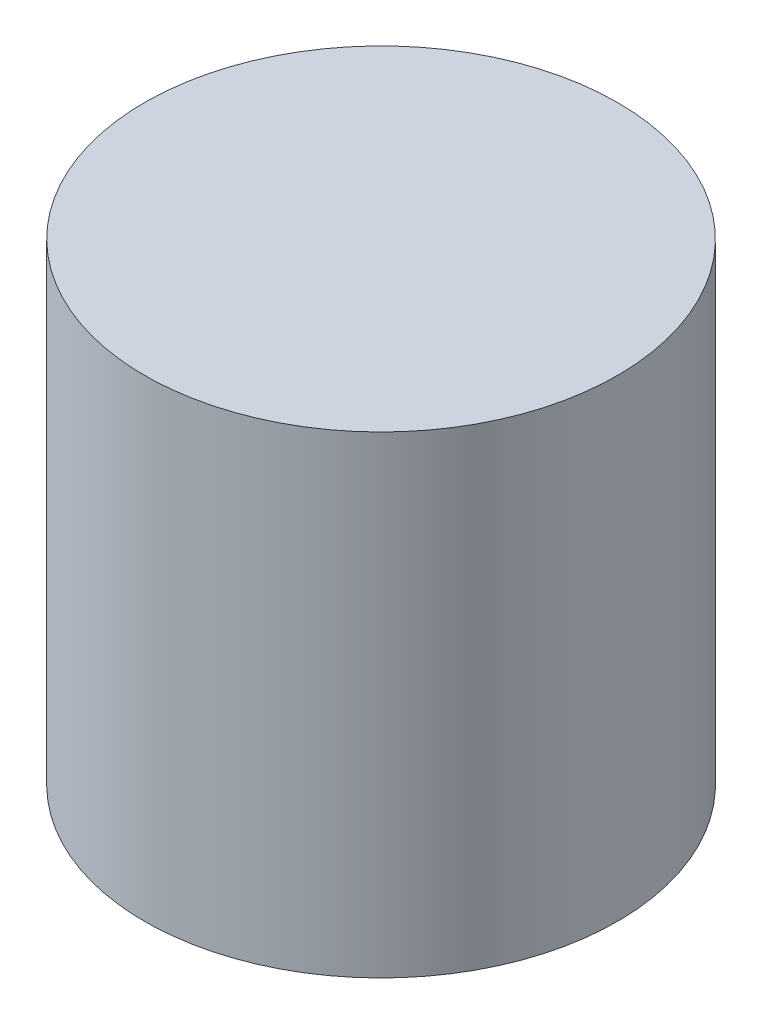
ISO-10303-21;
HEADER;
FILE_DESCRIPTION(('STEP AP214'),'2;1');
FILE_NAME('part.step','',(''),(''),'','','');
FILE_SCHEMA(('AUTOMOTIVE_DESIGN { 1 0 10303 214 1 1 1 1 }'));
ENDSEC;
DATA;
#1=APPLICATION_CONTEXT('core data for automotive mechanical design processes');
#2=APPLICATION_PROTOCOL_DEFINITION('international standard','automotive_design',2000,#1);
#3=PRODUCT_CONTEXT('',#1,'mechanical');
#4=PRODUCT('Part','Part','',(#3));
#5=PRODUCT_RELATED_PRODUCT_CATEGORY('part','',(#4));
#6=PRODUCT_DEFINITION_FORMATION('','',#4);
#7=PRODUCT_DEFINITION_CONTEXT('part definition',#1,'design');
#8=PRODUCT_DEFINITION('design','',#6,#7);
#9=PRODUCT_DEFINITION_SHAPE('','',#8);
#10=(LENGTH_UNIT() NAMED_UNIT(*) SI_UNIT(.MILLI.,.METRE.));
#11=(NAMED_UNIT(*) PLANE_ANGLE_UNIT() SI_UNIT($,.RADIAN.));
#12=(NAMED_UNIT(*) SI_UNIT($,.STERADIAN.) SOLID_ANGLE_UNIT());
#13=UNCERTAINTY_MEASURE_WITH_UNIT(LENGTH_MEASURE(1.E-05),#10,'distance_accuracy_value','');
#14=(GEOMETRIC_REPRESENTATION_CONTEXT(3) GLOBAL_UNCERTAINTY_ASSIGNED_CONTEXT((#13)) GLOBAL_UNIT_ASSIGNED_CONTEXT((#10,
#11,#12)) REPRESENTATION_CONTEXT('',''));
#15=CARTESIAN_POINT('',(0.,0.,0.));
#16=DIRECTION('',(0.,0.,1.));
#17=DIRECTION('',(1.,0.,0.));
#18=AXIS2_PLACEMENT_3D('',#15,#16,#17);
#19=CARTESIAN_POINT('',(0.,0.,0.));
#20=DIRECTION('',(0.,-1.,0.));
#21=DIRECTION('',(0.,0.,-1.));
#22=AXIS2_PLACEMENT_3D('',#19,#20,#21);
#23=CYLINDRICAL_SURFACE('',#22,35.);
#24=CARTESIAN_POINT('',(0.,65.,0.));
#25=DIRECTION('',(0.,1.,0.));
#26=DIRECTION('',(0.,0.,1.));
#27=AXIS2_PLACEMENT_3D('',#24,#25,#26);
#28=CIRCLE('',#27,35.);
#29=CARTESIAN_POINT('',(-32.6917420765551,65.,12.5));
#30=VERTEX_POINT('',#29);
#31=CARTESIAN_POINT('',(-32.6917420765551,65.,-12.5));
#32=VERTEX_POINT('',#31);
#33=EDGE_CURVE('E170',#30,#32,#28,.F.);
#34=ORIENTED_EDGE('',*,*,#33,.F.);
#35=DIRECTION('',(0.,-1.,0.));
#36=VECTOR('',#35,1.);
#37=CARTESIAN_POINT('',(-32.6917420765551,65.,12.5));
#38=LINE('',#37,#36);
#39=CARTESIAN_POINT('',(-32.6917420765551,5.,12.5));
#40=VERTEX_POINT('',#39);
#41=EDGE_CURVE('E130',#30,#40,#38,.T.);
#42=ORIENTED_EDGE('',*,*,#41,.T.);
#43=CARTESIAN_POINT('',(0.,5.,0.));
#44=DIRECTION('',(0.,1.,0.));
#45=DIRECTION('',(0.,0.,1.));
#46=AXIS2_PLACEMENT_3D('',#43,#44,#45);
#47=CIRCLE('',#46,35.);
#48=CARTESIAN_POINT('',(-32.691742076555,5.00000000000001,-12.5));
#49=VERTEX_POINT('',#48);
#50=EDGE_CURVE('E168',#40,#49,#47,.F.);
#51=ORIENTED_EDGE('',*,*,#50,.T.);
#52=DIRECTION('',(0.,-1.,0.));
#53=VECTOR('',#52,1.);
#54=CARTESIAN_POINT('',(-32.6917420765551,65.,-12.5));
#55=LINE('',#54,#53);
#56=EDGE_CURVE('E73',#32,#49,#55,.T.);
#57=ORIENTED_EDGE('',*,*,#56,.F.);
#58=EDGE_LOOP('',(#34,#42,#51,#57));
#59=FACE_BOUND('',#58,.T.);
#60=CARTESIAN_POINT('',(0.,70.,0.));
#61=DIRECTION('',(0.,-1.,0.));
#62=DIRECTION('',(0.,0.,-1.));
#63=AXIS2_PLACEMENT_3D('',#60,#61,#62);
#64=CIRCLE('',#63,35.);
#65=CARTESIAN_POINT('',(0.,70.,-35.));
#66=VERTEX_POINT('',#65);
#67=EDGE_CURVE('E129',#66,#66,#64,.T.);
#68=ORIENTED_EDGE('',*,*,#67,.T.);
#69=EDGE_LOOP('',(#68));
#70=FACE_BOUND('',#69,.T.);
#71=CARTESIAN_POINT('',(0.,0.,0.));
#72=DIRECTION('',(0.,-1.,0.));
#73=DIRECTION('',(0.,0.,-1.));
#74=AXIS2_PLACEMENT_3D('',#71,#72,#73);
#75=CIRCLE('',#74,35.);
#76=CARTESIAN_POINT('',(0.,0.,-35.));
#77=VERTEX_POINT('',#76);
#78=EDGE_CURVE('E123',#77,#77,#75,.T.);
#79=ORIENTED_EDGE('',*,*,#78,.F.);
#80=EDGE_LOOP('',(#79));
#81=FACE_BOUND('',#80,.T.);
#82=CARTESIAN_POINT('',(0.,54.9863118256936,0.));
#83=DIRECTION('',(0.,1.,0.));
#84=DIRECTION('',(-1.,0.,0.));
#85=AXIS2_PLACEMENT_3D('',#82,#83,#84);
#86=CIRCLE('',#85,35.);
#87=CARTESIAN_POINT('',(-18.6665575968191,54.9863118256936,-29.6067496947002));
#88=VERTEX_POINT('',#87);
#89=CARTESIAN_POINT('',(17.3852178868639,54.9863118256935,-30.3768694737669));
#90=VERTEX_POINT('',#89);
#91=EDGE_CURVE('E58',#88,#90,#86,.F.);
#92=ORIENTED_EDGE('',*,*,#91,.F.);
#93=DIRECTION('',(0.,-1.,0.));
#94=VECTOR('',#93,1.);
#95=CARTESIAN_POINT('',(-18.6665575968191,54.9863118256936,-29.6067496947002));
#96=LINE('',#95,#94);
#97=CARTESIAN_POINT('',(-18.6665575968192,14.9863118256936,-29.6067496947002));
#98=VERTEX_POINT('',#97);
#99=EDGE_CURVE('E104',#88,#98,#96,.T.);
#100=ORIENTED_EDGE('',*,*,#99,.T.);
#101=CARTESIAN_POINT('',(0.,14.9863118256936,0.));
#102=DIRECTION('',(0.,1.,0.));
#103=DIRECTION('',(-1.,0.,0.));
#104=AXIS2_PLACEMENT_3D('',#101,#102,#103);
#105=CIRCLE('',#104,35.);
#106=CARTESIAN_POINT('',(17.3852178868639,14.9863118256935,-30.3768694737669));
#107=VERTEX_POINT('',#106);
#108=EDGE_CURVE('E13',#98,#107,#105,.F.);
#109=ORIENTED_EDGE('',*,*,#108,.T.);
#110=DIRECTION('',(0.,-1.,0.));
#111=VECTOR('',#110,1.);
#112=CARTESIAN_POINT('',(17.3852178868639,54.9863118256935,-30.3768694737668));
#113=LINE('',#112,#111);
#114=EDGE_CURVE('E92',#90,#107,#113,.T.);
#115=ORIENTED_EDGE('',*,*,#114,.F.);
#116=EDGE_LOOP('',(#92,#100,#109,#115));
#117=FACE_BOUND('',#116,.T.);
#118=ADVANCED_FACE('F48',(#59,#70,#81,#117),#23,.T.);
#119=CARTESIAN_POINT('',(0.,70.,0.));
#120=DIRECTION('',(0.,1.,0.));
#121=DIRECTION('',(0.,0.,1.));
#122=AXIS2_PLACEMENT_3D('',#119,#120,#121);
#123=PLANE('',#122);
#124=ORIENTED_EDGE('',*,*,#67,.F.);
#125=EDGE_LOOP('',(#124));
#126=FACE_BOUND('',#125,.T.);
#127=ADVANCED_FACE('F50',(#126),#123,.T.);
#128=CARTESIAN_POINT('',(0.,0.,0.));
#129=DIRECTION('',(0.,-1.,0.));
#130=DIRECTION('',(0.,0.,-1.));
#131=AXIS2_PLACEMENT_3D('',#128,#129,#130);
#132=PLANE('',#131);
#133=ORIENTED_EDGE('',*,*,#78,.T.);
#134=EDGE_LOOP('',(#133));
#135=FACE_BOUND('',#134,.T.);
#136=ADVANCED_FACE('F196',(#135),#132,.T.);
#137=CARTESIAN_POINT('',(-32.691742076555,0.,0.));
#138=DIRECTION('',(1.,0.,0.));
#139=DIRECTION('',(0.,0.,-1.));
#140=AXIS2_PLACEMENT_3D('',#137,#138,#139);
#141=PLANE('',#140);
#142=DIRECTION('',(0.,0.,-1.));
#143=VECTOR('',#142,1.);
#144=CARTESIAN_POINT('',(-32.6917420765551,65.,12.5));
#145=LINE('',#144,#143);
#146=EDGE_CURVE('E146',#30,#32,#145,.T.);
#147=ORIENTED_EDGE('',*,*,#146,.T.);
#148=ORIENTED_EDGE('',*,*,#56,.T.);
#149=DIRECTION('',(0.,0.,-1.));
#150=VECTOR('',#149,1.);
#151=CARTESIAN_POINT('',(-32.6917420765551,5.,12.5));
#152=LINE('',#151,#150);
#153=EDGE_CURVE('E143',#40,#49,#152,.T.);
#154=ORIENTED_EDGE('',*,*,#153,.F.);
#155=ORIENTED_EDGE('',*,*,#41,.F.);
#156=EDGE_LOOP('',(#147,#148,#154,#155));
#157=FACE_BOUND('',#156,.T.);
#158=ADVANCED_FACE('F190',(#157),#141,.F.);
#159=CARTESIAN_POINT('',(-32.6917420765551,65.,12.5));
#160=DIRECTION('',(0.,1.,0.));
#161=DIRECTION('',(0.,0.,1.));
#162=AXIS2_PLACEMENT_3D('',#159,#160,#161);
#163=PLANE('',#162);
#164=ORIENTED_EDGE('',*,*,#33,.T.);
#165=ORIENTED_EDGE('',*,*,#146,.F.);
#166=EDGE_LOOP('',(#164,#165));
#167=FACE_BOUND('',#166,.T.);
#168=ADVANCED_FACE('F195',(#167),#163,.F.);
#169=CARTESIAN_POINT('',(-32.6917420765551,5.,12.5));
#170=DIRECTION('',(0.,1.,0.));
#171=DIRECTION('',(0.,0.,1.));
#172=AXIS2_PLACEMENT_3D('',#169,#170,#171);
#173=PLANE('',#172);
#174=ORIENTED_EDGE('',*,*,#153,.T.);
#175=ORIENTED_EDGE('',*,*,#50,.F.);
#176=EDGE_LOOP('',(#174,#175));
#177=FACE_BOUND('',#176,.T.);
#178=ADVANCED_FACE('F180',(#177),#173,.T.);
#179=CARTESIAN_POINT('',(-0.640669854977652,0.,-29.9918095842336));
#180=DIRECTION('',(0.0213566217156578,0.,0.999771921344511));
#181=DIRECTION('',(0.999771921344511,0.,-0.0213566217156578));
#182=AXIS2_PLACEMENT_3D('',#179,#180,#181);
#183=PLANE('',#182);
#184=DIRECTION('',(0.999771921344511,0.,-0.0213566217156581));
#185=VECTOR('',#184,1.);
#186=CARTESIAN_POINT('',(-18.6665575968191,54.9863118256936,-29.6067496947002));
#187=LINE('',#186,#185);
#188=EDGE_CURVE('E65',#88,#90,#187,.T.);
#189=ORIENTED_EDGE('',*,*,#188,.T.);
#190=ORIENTED_EDGE('',*,*,#114,.T.);
#191=DIRECTION('',(0.999771921344511,0.,-0.0213566217156585));
#192=VECTOR('',#191,1.);
#193=CARTESIAN_POINT('',(-18.6665575968192,14.9863118256936,-29.6067496947002));
#194=LINE('',#193,#192);
#195=EDGE_CURVE('E95',#98,#107,#194,.T.);
#196=ORIENTED_EDGE('',*,*,#195,.F.);
#197=ORIENTED_EDGE('',*,*,#99,.F.);
#198=EDGE_LOOP('',(#189,#190,#196,#197));
#199=FACE_BOUND('',#198,.T.);
#200=ADVANCED_FACE('F94',(#199),#183,.F.);
#201=CARTESIAN_POINT('',(-18.6665575968192,14.9863118256936,-29.6067496947002));
#202=DIRECTION('',(0.,1.,0.));
#203=DIRECTION('',(-1.,0.,0.));
#204=AXIS2_PLACEMENT_3D('',#201,#202,#203);
#205=PLANE('',#204);
#206=ORIENTED_EDGE('',*,*,#195,.T.);
#207=ORIENTED_EDGE('',*,*,#108,.F.);
#208=EDGE_LOOP('',(#206,#207));
#209=FACE_BOUND('',#208,.T.);
#210=ADVANCED_FACE('F102',(#209),#205,.T.);
#211=CARTESIAN_POINT('',(-18.6665575968191,54.9863118256936,-29.6067496947002));
#212=DIRECTION('',(0.,1.,0.));
#213=DIRECTION('',(-1.,0.,0.));
#214=AXIS2_PLACEMENT_3D('',#211,#212,#213);
#215=PLANE('',#214);
#216=ORIENTED_EDGE('',*,*,#91,.T.);
#217=ORIENTED_EDGE('',*,*,#188,.F.);
#218=EDGE_LOOP('',(#216,#217));
#219=FACE_BOUND('',#218,.T.);
#220=ADVANCED_FACE('F198',(#219),#215,.F.);
#221=CLOSED_SHELL('',(#118,#127,#136,#158,#168,#178,#200,#210,#220));
#222=MANIFOLD_SOLID_BREP('B2',#221);
#223=ADVANCED_BREP_SHAPE_REPRESENTATION('',(#18,#222),#14);
#224=SHAPE_DEFINITION_REPRESENTATION(#9,#223);
ENDSEC;
END-ISO-10303-21;
